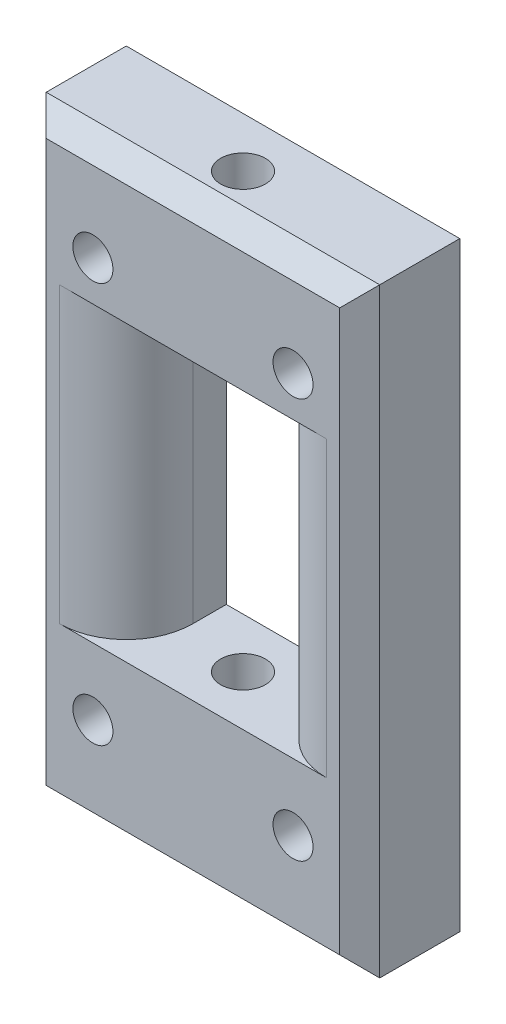
ISO-10303-21;
HEADER;
FILE_DESCRIPTION(('STEP AP214'),'2;1');
FILE_NAME('part.step','',(''),(''),'','','');
FILE_SCHEMA(('AUTOMOTIVE_DESIGN { 1 0 10303 214 1 1 1 1 }'));
ENDSEC;
DATA;
#1=APPLICATION_CONTEXT('core data for automotive mechanical design processes');
#2=APPLICATION_PROTOCOL_DEFINITION('international standard','automotive_design',2000,#1);
#3=PRODUCT_CONTEXT('',#1,'mechanical');
#4=PRODUCT('Part','Part','',(#3));
#5=PRODUCT_RELATED_PRODUCT_CATEGORY('part','',(#4));
#6=PRODUCT_DEFINITION_FORMATION('','',#4);
#7=PRODUCT_DEFINITION_CONTEXT('part definition',#1,'design');
#8=PRODUCT_DEFINITION('design','',#6,#7);
#9=PRODUCT_DEFINITION_SHAPE('','',#8);
#10=(LENGTH_UNIT() NAMED_UNIT(*) SI_UNIT(.MILLI.,.METRE.));
#11=(NAMED_UNIT(*) PLANE_ANGLE_UNIT() SI_UNIT($,.RADIAN.));
#12=(NAMED_UNIT(*) SI_UNIT($,.STERADIAN.) SOLID_ANGLE_UNIT());
#13=UNCERTAINTY_MEASURE_WITH_UNIT(LENGTH_MEASURE(1.E-05),#10,'distance_accuracy_value','');
#14=(GEOMETRIC_REPRESENTATION_CONTEXT(3) GLOBAL_UNCERTAINTY_ASSIGNED_CONTEXT((#13)) GLOBAL_UNIT_ASSIGNED_CONTEXT((#10,
#11,#12)) REPRESENTATION_CONTEXT('',''));
#15=CARTESIAN_POINT('',(0.,0.,0.));
#16=DIRECTION('',(0.,0.,1.));
#17=DIRECTION('',(1.,0.,0.));
#18=AXIS2_PLACEMENT_3D('',#15,#16,#17);
#19=CARTESIAN_POINT('',(100.,5.,7.5));
#20=DIRECTION('',(0.,1.,0.));
#21=DIRECTION('',(0.,0.,1.));
#22=AXIS2_PLACEMENT_3D('',#19,#20,#21);
#23=CYLINDRICAL_SURFACE('',#22,3.35);
#24=CARTESIAN_POINT('',(100.,74.,7.5));
#25=DIRECTION('',(0.,1.,0.));
#26=DIRECTION('',(0.,0.,1.));
#27=AXIS2_PLACEMENT_3D('',#24,#25,#26);
#28=CIRCLE('',#27,3.35);
#29=CARTESIAN_POINT('',(100.,74.,10.85));
#30=VERTEX_POINT('',#29);
#31=EDGE_CURVE('E173',#30,#30,#28,.F.);
#32=CARTESIAN_POINT('',(100.,95.,7.5));
#33=DIRECTION('',(0.,1.,0.));
#34=DIRECTION('',(0.,0.,1.));
#35=AXIS2_PLACEMENT_3D('',#32,#33,#34);
#36=CIRCLE('',#35,3.35);
#37=CARTESIAN_POINT('',(100.,95.,10.85));
#38=VERTEX_POINT('',#37);
#39=EDGE_CURVE('E170',#38,#38,#36,.T.);
#40=CARTESIAN_POINT('',(100.,74.,10.85));
#41=CARTESIAN_POINT('',(100.,74.21875,10.85));
#42=CARTESIAN_POINT('',(100.,74.4375,10.85));
#43=CARTESIAN_POINT('',(100.,74.875,10.85));
#44=CARTESIAN_POINT('',(100.,75.09375,10.85));
#45=CARTESIAN_POINT('',(100.,75.53125,10.85));
#46=CARTESIAN_POINT('',(100.,75.75,10.85));
#47=CARTESIAN_POINT('',(100.,76.1875,10.85));
#48=CARTESIAN_POINT('',(100.,76.40625,10.85));
#49=CARTESIAN_POINT('',(100.,76.84375,10.85));
#50=CARTESIAN_POINT('',(100.,77.0625,10.85));
#51=CARTESIAN_POINT('',(100.,77.5,10.85));
#52=CARTESIAN_POINT('',(100.,77.71875,10.85));
#53=CARTESIAN_POINT('',(100.,78.15625,10.85));
#54=CARTESIAN_POINT('',(100.,78.375,10.85));
#55=CARTESIAN_POINT('',(100.,78.8125,10.85));
#56=CARTESIAN_POINT('',(100.,79.03125,10.85));
#57=CARTESIAN_POINT('',(100.,79.46875,10.85));
#58=CARTESIAN_POINT('',(100.,79.6875,10.85));
#59=CARTESIAN_POINT('',(100.,80.125,10.85));
#60=CARTESIAN_POINT('',(100.,80.34375,10.85));
#61=CARTESIAN_POINT('',(100.,80.78125,10.85));
#62=CARTESIAN_POINT('',(100.,81.,10.85));
#63=CARTESIAN_POINT('',(100.,81.4375,10.85));
#64=CARTESIAN_POINT('',(100.,81.65625,10.85));
#65=CARTESIAN_POINT('',(100.,82.09375,10.85));
#66=CARTESIAN_POINT('',(100.,82.3125,10.85));
#67=CARTESIAN_POINT('',(100.,82.75,10.85));
#68=CARTESIAN_POINT('',(100.,82.96875,10.85));
#69=CARTESIAN_POINT('',(100.,83.40625,10.85));
#70=CARTESIAN_POINT('',(100.,83.625,10.85));
#71=CARTESIAN_POINT('',(100.,84.0625,10.85));
#72=CARTESIAN_POINT('',(100.,84.28125,10.85));
#73=CARTESIAN_POINT('',(100.,84.71875,10.85));
#74=CARTESIAN_POINT('',(100.,84.9375,10.85));
#75=CARTESIAN_POINT('',(100.,85.375,10.85));
#76=CARTESIAN_POINT('',(100.,85.59375,10.85));
#77=CARTESIAN_POINT('',(100.,86.03125,10.85));
#78=CARTESIAN_POINT('',(100.,86.25,10.85));
#79=CARTESIAN_POINT('',(100.,86.6875,10.85));
#80=CARTESIAN_POINT('',(100.,86.90625,10.85));
#81=CARTESIAN_POINT('',(100.,87.34375,10.85));
#82=CARTESIAN_POINT('',(100.,87.5625,10.85));
#83=CARTESIAN_POINT('',(100.,88.,10.85));
#84=CARTESIAN_POINT('',(100.,88.21875,10.85));
#85=CARTESIAN_POINT('',(100.,88.65625,10.85));
#86=CARTESIAN_POINT('',(100.,88.875,10.85));
#87=CARTESIAN_POINT('',(100.,89.3125,10.85));
#88=CARTESIAN_POINT('',(100.,89.53125,10.85));
#89=CARTESIAN_POINT('',(100.,89.96875,10.85));
#90=CARTESIAN_POINT('',(100.,90.1875,10.85));
#91=CARTESIAN_POINT('',(100.,90.625,10.85));
#92=CARTESIAN_POINT('',(100.,90.84375,10.85));
#93=CARTESIAN_POINT('',(100.,91.28125,10.85));
#94=CARTESIAN_POINT('',(100.,91.5,10.85));
#95=CARTESIAN_POINT('',(100.,91.9375,10.85));
#96=CARTESIAN_POINT('',(100.,92.15625,10.85));
#97=CARTESIAN_POINT('',(100.,92.59375,10.85));
#98=CARTESIAN_POINT('',(100.,92.8125,10.85));
#99=CARTESIAN_POINT('',(100.,93.25,10.85));
#100=CARTESIAN_POINT('',(100.,93.46875,10.85));
#101=CARTESIAN_POINT('',(100.,93.90625,10.85));
#102=CARTESIAN_POINT('',(100.,94.125,10.85));
#103=CARTESIAN_POINT('',(100.,94.5625,10.85));
#104=CARTESIAN_POINT('',(100.,94.78125,10.85));
#105=CARTESIAN_POINT('',(100.,95.,10.85));
#106=B_SPLINE_CURVE_WITH_KNOTS('',3,(#40,#41,#42,#43,#44,#45,#46,#47,#48,#49,#50,#51,#52,#53,
#54,#55,#56,#57,#58,#59,#60,#61,#62,#63,#64,#65,#66,#67,#68,#69,#70,#71,#72,#73,#74,#75,#76,#77,
#78,#79,#80,#81,#82,#83,#84,#85,#86,#87,#88,#89,#90,#91,#92,#93,#94,#95,#96,#97,#98,#99,#100,
#101,#102,#103,#104,#105),.UNSPECIFIED.,.F.,.F.,(4,2,2,2,2,2,2,2,2,2,2,2,2,2,2,2,2,2,2,2,2,2,2,
2,2,2,2,2,2,2,2,2,4),(0.,0.656249999999997,1.31249999999999,1.96875000000001,2.625,3.28125,
3.9375,4.59374999999999,5.25,5.90625,6.5625,7.21875,7.87499999999999,8.53124999999999,9.1875,
9.84375,10.5,11.15625,11.8125,12.46875,13.125,13.78125,14.4375,15.09375,15.75,16.40625,17.0625,
17.71875,18.375,19.03125,19.6875,20.34375,21.),.UNSPECIFIED.);
#107=EDGE_CURVE('BSEAM35',#30,#38,#106,.T.);
#108=ORIENTED_EDGE('',*,*,#31,.T.);
#109=ORIENTED_EDGE('',*,*,#39,.T.);
#110=ORIENTED_EDGE('',*,*,#107,.T.);
#111=ORIENTED_EDGE('',*,*,#107,.F.);
#112=EDGE_LOOP('',(#108,#110,#109,#111));
#113=FACE_BOUND('',#112,.T.);
#114=ADVANCED_FACE('F35',(#113),#23,.F.);
#115=CARTESIAN_POINT('',(0.,0.,15.));
#116=DIRECTION('',(0.,0.,1.));
#117=DIRECTION('',(1.,0.,0.));
#118=AXIS2_PLACEMENT_3D('',#115,#116,#117);
#119=PLANE('',#118);
#120=DIRECTION('',(0.,-1.,0.));
#121=VECTOR('',#120,1.);
#122=CARTESIAN_POINT('',(78.,5.,15.));
#123=LINE('',#122,#121);
#124=CARTESIAN_POINT('',(78.,92.,15.));
#125=VERTEX_POINT('',#124);
#126=CARTESIAN_POINT('',(78.,8.,15.));
#127=VERTEX_POINT('',#126);
#128=EDGE_CURVE('E217',#125,#127,#123,.T.);
#129=ORIENTED_EDGE('',*,*,#128,.T.);
#130=DIRECTION('',(1.,0.,0.));
#131=VECTOR('',#130,1.);
#132=CARTESIAN_POINT('',(125.,8.,15.));
#133=LINE('',#132,#131);
#134=CARTESIAN_POINT('',(122.,8.,15.));
#135=VERTEX_POINT('',#134);
#136=EDGE_CURVE('E227',#127,#135,#133,.T.);
#137=ORIENTED_EDGE('',*,*,#136,.T.);
#138=DIRECTION('',(0.,1.,0.));
#139=VECTOR('',#138,1.);
#140=CARTESIAN_POINT('',(122.,95.,15.));
#141=LINE('',#140,#139);
#142=CARTESIAN_POINT('',(122.,92.,15.));
#143=VERTEX_POINT('',#142);
#144=EDGE_CURVE('E225',#135,#143,#141,.T.);
#145=ORIENTED_EDGE('',*,*,#144,.T.);
#146=DIRECTION('',(-1.,0.,0.));
#147=VECTOR('',#146,1.);
#148=CARTESIAN_POINT('',(75.,92.,15.));
#149=LINE('',#148,#147);
#150=EDGE_CURVE('E223',#143,#125,#149,.T.);
#151=ORIENTED_EDGE('',*,*,#150,.T.);
#152=EDGE_LOOP('',(#129,#137,#145,#151));
#153=FACE_BOUND('',#152,.T.);
#154=DIRECTION('',(1.,0.,0.));
#155=VECTOR('',#154,1.);
#156=CARTESIAN_POINT('',(110.,30.,15.));
#157=LINE('',#156,#155);
#158=CARTESIAN_POINT('',(80.,30.,15.));
#159=VERTEX_POINT('',#158);
#160=CARTESIAN_POINT('',(120.,30.,15.));
#161=VERTEX_POINT('',#160);
#162=EDGE_CURVE('E151',#159,#161,#157,.T.);
#163=ORIENTED_EDGE('',*,*,#162,.F.);
#164=DIRECTION('',(0.,-1.,0.));
#165=VECTOR('',#164,1.);
#166=CARTESIAN_POINT('',(80.,74.,15.));
#167=LINE('',#166,#165);
#168=CARTESIAN_POINT('',(80.,74.,15.));
#169=VERTEX_POINT('',#168);
#170=EDGE_CURVE('E253',#159,#169,#167,.F.);
#171=ORIENTED_EDGE('',*,*,#170,.T.);
#172=DIRECTION('',(-1.,0.,0.));
#173=VECTOR('',#172,1.);
#174=CARTESIAN_POINT('',(90.,74.,15.));
#175=LINE('',#174,#173);
#176=CARTESIAN_POINT('',(120.,74.,15.));
#177=VERTEX_POINT('',#176);
#178=EDGE_CURVE('E153',#177,#169,#175,.T.);
#179=ORIENTED_EDGE('',*,*,#178,.F.);
#180=DIRECTION('',(0.,1.,0.));
#181=VECTOR('',#180,1.);
#182=CARTESIAN_POINT('',(120.,30.,15.));
#183=LINE('',#182,#181);
#184=EDGE_CURVE('E250',#177,#161,#183,.F.);
#185=ORIENTED_EDGE('',*,*,#184,.T.);
#186=EDGE_LOOP('',(#163,#171,#179,#185));
#187=FACE_BOUND('',#186,.T.);
#188=CARTESIAN_POINT('',(115.,80.,15.));
#189=DIRECTION('',(0.,0.,1.));
#190=DIRECTION('',(1.,0.,0.));
#191=AXIS2_PLACEMENT_3D('',#188,#189,#190);
#192=CIRCLE('',#191,3.00000000000001);
#193=CARTESIAN_POINT('',(118.,80.,15.));
#194=VERTEX_POINT('',#193);
#195=EDGE_CURVE('E180',#194,#194,#192,.T.);
#196=ORIENTED_EDGE('',*,*,#195,.F.);
#197=EDGE_LOOP('',(#196));
#198=FACE_BOUND('',#197,.T.);
#199=CARTESIAN_POINT('',(115.,20.,15.));
#200=DIRECTION('',(0.,0.,1.));
#201=DIRECTION('',(1.,0.,0.));
#202=AXIS2_PLACEMENT_3D('',#199,#200,#201);
#203=CIRCLE('',#202,3.00000000000001);
#204=CARTESIAN_POINT('',(118.,20.,15.));
#205=VERTEX_POINT('',#204);
#206=EDGE_CURVE('E192',#205,#205,#203,.T.);
#207=ORIENTED_EDGE('',*,*,#206,.F.);
#208=EDGE_LOOP('',(#207));
#209=FACE_BOUND('',#208,.T.);
#210=CARTESIAN_POINT('',(85.,20.,15.));
#211=DIRECTION('',(0.,0.,1.));
#212=DIRECTION('',(1.,0.,0.));
#213=AXIS2_PLACEMENT_3D('',#210,#211,#212);
#214=CIRCLE('',#213,3.00000000000001);
#215=CARTESIAN_POINT('',(88.,20.,15.));
#216=VERTEX_POINT('',#215);
#217=EDGE_CURVE('E186',#216,#216,#214,.T.);
#218=ORIENTED_EDGE('',*,*,#217,.F.);
#219=EDGE_LOOP('',(#218));
#220=FACE_BOUND('',#219,.T.);
#221=CARTESIAN_POINT('',(85.,80.,15.));
#222=DIRECTION('',(0.,0.,1.));
#223=DIRECTION('',(1.,0.,0.));
#224=AXIS2_PLACEMENT_3D('',#221,#222,#223);
#225=CIRCLE('',#224,3.00000000000001);
#226=CARTESIAN_POINT('',(88.,80.,15.));
#227=VERTEX_POINT('',#226);
#228=EDGE_CURVE('E174',#227,#227,#225,.T.);
#229=ORIENTED_EDGE('',*,*,#228,.F.);
#230=EDGE_LOOP('',(#229));
#231=FACE_BOUND('',#230,.T.);
#232=ADVANCED_FACE('F262',(#153,#187,#198,#209,#220,#231),#119,.T.);
#233=CARTESIAN_POINT('',(0.,0.,0.));
#234=DIRECTION('',(0.,0.,1.));
#235=DIRECTION('',(1.,0.,0.));
#236=AXIS2_PLACEMENT_3D('',#233,#234,#235);
#237=PLANE('',#236);
#238=DIRECTION('',(0.,1.,0.));
#239=VECTOR('',#238,1.);
#240=CARTESIAN_POINT('',(110.,70.,0.));
#241=LINE('',#240,#239);
#242=CARTESIAN_POINT('',(110.,30.,0.));
#243=VERTEX_POINT('',#242);
#244=CARTESIAN_POINT('',(110.,74.,0.));
#245=VERTEX_POINT('',#244);
#246=EDGE_CURVE('E137',#243,#245,#241,.T.);
#247=ORIENTED_EDGE('',*,*,#246,.T.);
#248=DIRECTION('',(-1.,0.,0.));
#249=VECTOR('',#248,1.);
#250=CARTESIAN_POINT('',(90.,74.,0.));
#251=LINE('',#250,#249);
#252=CARTESIAN_POINT('',(90.,74.,0.));
#253=VERTEX_POINT('',#252);
#254=EDGE_CURVE('E129',#245,#253,#251,.T.);
#255=ORIENTED_EDGE('',*,*,#254,.T.);
#256=DIRECTION('',(0.,-1.,0.));
#257=VECTOR('',#256,1.);
#258=CARTESIAN_POINT('',(90.,70.,0.));
#259=LINE('',#258,#257);
#260=CARTESIAN_POINT('',(90.,30.,0.));
#261=VERTEX_POINT('',#260);
#262=EDGE_CURVE('E141',#253,#261,#259,.T.);
#263=ORIENTED_EDGE('',*,*,#262,.T.);
#264=DIRECTION('',(1.,0.,0.));
#265=VECTOR('',#264,1.);
#266=CARTESIAN_POINT('',(110.,30.,0.));
#267=LINE('',#266,#265);
#268=EDGE_CURVE('E146',#261,#243,#267,.T.);
#269=ORIENTED_EDGE('',*,*,#268,.T.);
#270=EDGE_LOOP('',(#247,#255,#263,#269));
#271=FACE_BOUND('',#270,.T.);
#272=DIRECTION('',(0.,1.,0.));
#273=VECTOR('',#272,1.);
#274=CARTESIAN_POINT('',(125.,95.,0.));
#275=LINE('',#274,#273);
#276=CARTESIAN_POINT('',(125.,5.,0.));
#277=VERTEX_POINT('',#276);
#278=CARTESIAN_POINT('',(125.,95.,0.));
#279=VERTEX_POINT('',#278);
#280=EDGE_CURVE('E195',#277,#279,#275,.T.);
#281=ORIENTED_EDGE('',*,*,#280,.F.);
#282=DIRECTION('',(1.,0.,0.));
#283=VECTOR('',#282,1.);
#284=CARTESIAN_POINT('',(75.,5.,0.));
#285=LINE('',#284,#283);
#286=CARTESIAN_POINT('',(75.,5.,0.));
#287=VERTEX_POINT('',#286);
#288=EDGE_CURVE('E206',#287,#277,#285,.T.);
#289=ORIENTED_EDGE('',*,*,#288,.F.);
#290=DIRECTION('',(0.,-1.,0.));
#291=VECTOR('',#290,1.);
#292=CARTESIAN_POINT('',(75.,95.,0.));
#293=LINE('',#292,#291);
#294=CARTESIAN_POINT('',(75.,95.,0.));
#295=VERTEX_POINT('',#294);
#296=EDGE_CURVE('E203',#295,#287,#293,.T.);
#297=ORIENTED_EDGE('',*,*,#296,.F.);
#298=DIRECTION('',(-1.,0.,0.));
#299=VECTOR('',#298,1.);
#300=CARTESIAN_POINT('',(75.,95.,0.));
#301=LINE('',#300,#299);
#302=EDGE_CURVE('E200',#279,#295,#301,.T.);
#303=ORIENTED_EDGE('',*,*,#302,.F.);
#304=EDGE_LOOP('',(#281,#289,#297,#303));
#305=FACE_BOUND('',#304,.T.);
#306=CARTESIAN_POINT('',(115.,20.,0.));
#307=DIRECTION('',(0.,0.,1.));
#308=DIRECTION('',(1.,0.,0.));
#309=AXIS2_PLACEMENT_3D('',#306,#307,#308);
#310=CIRCLE('',#309,3.00000000000001);
#311=CARTESIAN_POINT('',(118.,20.,0.));
#312=VERTEX_POINT('',#311);
#313=EDGE_CURVE('E189',#312,#312,#310,.T.);
#314=ORIENTED_EDGE('',*,*,#313,.T.);
#315=EDGE_LOOP('',(#314));
#316=FACE_BOUND('',#315,.T.);
#317=CARTESIAN_POINT('',(85.,20.,0.));
#318=DIRECTION('',(0.,0.,1.));
#319=DIRECTION('',(1.,0.,0.));
#320=AXIS2_PLACEMENT_3D('',#317,#318,#319);
#321=CIRCLE('',#320,3.00000000000001);
#322=CARTESIAN_POINT('',(88.,20.,0.));
#323=VERTEX_POINT('',#322);
#324=EDGE_CURVE('E183',#323,#323,#321,.T.);
#325=ORIENTED_EDGE('',*,*,#324,.T.);
#326=EDGE_LOOP('',(#325));
#327=FACE_BOUND('',#326,.T.);
#328=CARTESIAN_POINT('',(115.,80.,0.));
#329=DIRECTION('',(0.,0.,1.));
#330=DIRECTION('',(1.,0.,0.));
#331=AXIS2_PLACEMENT_3D('',#328,#329,#330);
#332=CIRCLE('',#331,3.00000000000001);
#333=CARTESIAN_POINT('',(118.,80.,0.));
#334=VERTEX_POINT('',#333);
#335=EDGE_CURVE('E177',#334,#334,#332,.T.);
#336=ORIENTED_EDGE('',*,*,#335,.T.);
#337=EDGE_LOOP('',(#336));
#338=FACE_BOUND('',#337,.T.);
#339=CARTESIAN_POINT('',(85.,80.,0.));
#340=DIRECTION('',(0.,0.,1.));
#341=DIRECTION('',(1.,0.,0.));
#342=AXIS2_PLACEMENT_3D('',#339,#340,#341);
#343=CIRCLE('',#342,3.00000000000001);
#344=CARTESIAN_POINT('',(88.,80.,0.));
#345=VERTEX_POINT('',#344);
#346=EDGE_CURVE('E169',#345,#345,#343,.T.);
#347=ORIENTED_EDGE('',*,*,#346,.T.);
#348=EDGE_LOOP('',(#347));
#349=FACE_BOUND('',#348,.T.);
#350=ADVANCED_FACE('F148',(#271,#305,#316,#327,#338,#349),#237,.F.);
#351=CARTESIAN_POINT('',(125.,95.,15.));
#352=DIRECTION('',(-1.,0.,0.));
#353=DIRECTION('',(0.,0.,1.));
#354=AXIS2_PLACEMENT_3D('',#351,#352,#353);
#355=PLANE('',#354);
#356=DIRECTION('',(0.,0.,-1.));
#357=VECTOR('',#356,1.);
#358=CARTESIAN_POINT('',(125.,95.,15.));
#359=LINE('',#358,#357);
#360=CARTESIAN_POINT('',(125.,95.,12.));
#361=VERTEX_POINT('',#360);
#362=EDGE_CURVE('E215',#361,#279,#359,.T.);
#363=ORIENTED_EDGE('',*,*,#362,.F.);
#364=DIRECTION('',(0.,-1.,0.));
#365=VECTOR('',#364,1.);
#366=CARTESIAN_POINT('',(125.,5.,12.));
#367=LINE('',#366,#365);
#368=CARTESIAN_POINT('',(125.,5.,12.));
#369=VERTEX_POINT('',#368);
#370=EDGE_CURVE('E233',#361,#369,#367,.T.);
#371=ORIENTED_EDGE('',*,*,#370,.T.);
#372=DIRECTION('',(0.,0.,-1.));
#373=VECTOR('',#372,1.);
#374=CARTESIAN_POINT('',(125.,5.,15.));
#375=LINE('',#374,#373);
#376=EDGE_CURVE('E209',#369,#277,#375,.T.);
#377=ORIENTED_EDGE('',*,*,#376,.T.);
#378=ORIENTED_EDGE('',*,*,#280,.T.);
#379=EDGE_LOOP('',(#363,#371,#377,#378));
#380=FACE_BOUND('',#379,.T.);
#381=ADVANCED_FACE('F370',(#380),#355,.F.);
#382=CARTESIAN_POINT('',(75.,95.,15.));
#383=DIRECTION('',(0.,-1.,0.));
#384=DIRECTION('',(0.,0.,-1.));
#385=AXIS2_PLACEMENT_3D('',#382,#383,#384);
#386=PLANE('',#385);
#387=ORIENTED_EDGE('',*,*,#39,.F.);
#388=EDGE_LOOP('',(#387));
#389=FACE_BOUND('',#388,.T.);
#390=DIRECTION('',(0.,0.,-1.));
#391=VECTOR('',#390,1.);
#392=CARTESIAN_POINT('',(75.,95.,15.));
#393=LINE('',#392,#391);
#394=CARTESIAN_POINT('',(75.,95.,12.));
#395=VERTEX_POINT('',#394);
#396=EDGE_CURVE('E213',#395,#295,#393,.T.);
#397=ORIENTED_EDGE('',*,*,#396,.F.);
#398=DIRECTION('',(1.,0.,0.));
#399=VECTOR('',#398,1.);
#400=CARTESIAN_POINT('',(125.,95.,12.));
#401=LINE('',#400,#399);
#402=EDGE_CURVE('E235',#395,#361,#401,.T.);
#403=ORIENTED_EDGE('',*,*,#402,.T.);
#404=ORIENTED_EDGE('',*,*,#362,.T.);
#405=ORIENTED_EDGE('',*,*,#302,.T.);
#406=EDGE_LOOP('',(#397,#403,#404,#405));
#407=FACE_BOUND('',#406,.T.);
#408=ADVANCED_FACE('F339',(#389,#407),#386,.F.);
#409=CARTESIAN_POINT('',(75.,95.,15.));
#410=DIRECTION('',(1.,0.,0.));
#411=DIRECTION('',(0.,0.,-1.));
#412=AXIS2_PLACEMENT_3D('',#409,#410,#411);
#413=PLANE('',#412);
#414=DIRECTION('',(0.,0.,-1.));
#415=VECTOR('',#414,1.);
#416=CARTESIAN_POINT('',(75.,5.,15.));
#417=LINE('',#416,#415);
#418=CARTESIAN_POINT('',(75.,5.,12.));
#419=VERTEX_POINT('',#418);
#420=EDGE_CURVE('E211',#419,#287,#417,.T.);
#421=ORIENTED_EDGE('',*,*,#420,.F.);
#422=DIRECTION('',(0.,1.,0.));
#423=VECTOR('',#422,1.);
#424=CARTESIAN_POINT('',(75.,95.,12.));
#425=LINE('',#424,#423);
#426=EDGE_CURVE('E237',#419,#395,#425,.T.);
#427=ORIENTED_EDGE('',*,*,#426,.T.);
#428=ORIENTED_EDGE('',*,*,#396,.T.);
#429=ORIENTED_EDGE('',*,*,#296,.T.);
#430=EDGE_LOOP('',(#421,#427,#428,#429));
#431=FACE_BOUND('',#430,.T.);
#432=ADVANCED_FACE('F311',(#431),#413,.F.);
#433=CARTESIAN_POINT('',(75.,5.,15.));
#434=DIRECTION('',(0.,1.,0.));
#435=DIRECTION('',(0.,0.,1.));
#436=AXIS2_PLACEMENT_3D('',#433,#434,#435);
#437=PLANE('',#436);
#438=CARTESIAN_POINT('',(100.,5.,7.5));
#439=DIRECTION('',(0.,1.,0.));
#440=DIRECTION('',(0.,0.,1.));
#441=AXIS2_PLACEMENT_3D('',#438,#439,#440);
#442=CIRCLE('',#441,3.35);
#443=CARTESIAN_POINT('',(100.,5.,10.85));
#444=VERTEX_POINT('',#443);
#445=EDGE_CURVE('E166',#444,#444,#442,.T.);
#446=ORIENTED_EDGE('',*,*,#445,.T.);
#447=EDGE_LOOP('',(#446));
#448=FACE_BOUND('',#447,.T.);
#449=ORIENTED_EDGE('',*,*,#376,.F.);
#450=DIRECTION('',(-1.,0.,0.));
#451=VECTOR('',#450,1.);
#452=CARTESIAN_POINT('',(75.,5.,12.));
#453=LINE('',#452,#451);
#454=EDGE_CURVE('E230',#369,#419,#453,.T.);
#455=ORIENTED_EDGE('',*,*,#454,.T.);
#456=ORIENTED_EDGE('',*,*,#420,.T.);
#457=ORIENTED_EDGE('',*,*,#288,.T.);
#458=EDGE_LOOP('',(#449,#455,#456,#457));
#459=FACE_BOUND('',#458,.T.);
#460=ADVANCED_FACE('F307',(#448,#459),#437,.F.);
#461=CARTESIAN_POINT('',(115.,20.,15.));
#462=DIRECTION('',(0.,0.,-1.));
#463=DIRECTION('',(-1.,0.,0.));
#464=AXIS2_PLACEMENT_3D('',#461,#462,#463);
#465=CYLINDRICAL_SURFACE('',#464,3.00000000000001);
#466=ORIENTED_EDGE('',*,*,#206,.T.);
#467=EDGE_LOOP('',(#466));
#468=FACE_BOUND('',#467,.T.);
#469=ORIENTED_EDGE('',*,*,#313,.F.);
#470=EDGE_LOOP('',(#469));
#471=FACE_BOUND('',#470,.T.);
#472=ADVANCED_FACE('F310',(#468,#471),#465,.F.);
#473=CARTESIAN_POINT('',(85.,20.,15.));
#474=DIRECTION('',(0.,0.,-1.));
#475=DIRECTION('',(-1.,0.,0.));
#476=AXIS2_PLACEMENT_3D('',#473,#474,#475);
#477=CYLINDRICAL_SURFACE('',#476,3.00000000000001);
#478=ORIENTED_EDGE('',*,*,#217,.T.);
#479=EDGE_LOOP('',(#478));
#480=FACE_BOUND('',#479,.T.);
#481=ORIENTED_EDGE('',*,*,#324,.F.);
#482=EDGE_LOOP('',(#481));
#483=FACE_BOUND('',#482,.T.);
#484=ADVANCED_FACE('F386',(#480,#483),#477,.F.);
#485=CARTESIAN_POINT('',(115.,80.,15.));
#486=DIRECTION('',(0.,0.,-1.));
#487=DIRECTION('',(-1.,0.,0.));
#488=AXIS2_PLACEMENT_3D('',#485,#486,#487);
#489=CYLINDRICAL_SURFACE('',#488,3.00000000000001);
#490=ORIENTED_EDGE('',*,*,#195,.T.);
#491=EDGE_LOOP('',(#490));
#492=FACE_BOUND('',#491,.T.);
#493=ORIENTED_EDGE('',*,*,#335,.F.);
#494=EDGE_LOOP('',(#493));
#495=FACE_BOUND('',#494,.T.);
#496=ADVANCED_FACE('F301',(#492,#495),#489,.F.);
#497=CARTESIAN_POINT('',(85.,80.,15.));
#498=DIRECTION('',(0.,0.,-1.));
#499=DIRECTION('',(-1.,0.,0.));
#500=AXIS2_PLACEMENT_3D('',#497,#498,#499);
#501=CYLINDRICAL_SURFACE('',#500,3.00000000000001);
#502=ORIENTED_EDGE('',*,*,#228,.T.);
#503=EDGE_LOOP('',(#502));
#504=FACE_BOUND('',#503,.T.);
#505=ORIENTED_EDGE('',*,*,#346,.F.);
#506=EDGE_LOOP('',(#505));
#507=FACE_BOUND('',#506,.T.);
#508=ADVANCED_FACE('F294',(#504,#507),#501,.F.);
#509=CARTESIAN_POINT('',(100.,30.,7.5));
#510=DIRECTION('',(0.,-1.,0.));
#511=DIRECTION('',(0.,0.,-1.));
#512=AXIS2_PLACEMENT_3D('',#509,#510,#511);
#513=CIRCLE('',#512,3.35);
#514=CARTESIAN_POINT('',(100.,30.,10.85));
#515=VERTEX_POINT('',#514);
#516=EDGE_CURVE('E162',#515,#515,#513,.F.);
#517=CARTESIAN_POINT('',(100.,30.,10.85));
#518=CARTESIAN_POINT('',(100.,29.7395833333333,10.85));
#519=CARTESIAN_POINT('',(100.,29.4791666666667,10.85));
#520=CARTESIAN_POINT('',(100.,28.9583333333333,10.85));
#521=CARTESIAN_POINT('',(100.,28.6979166666667,10.85));
#522=CARTESIAN_POINT('',(100.,28.1770833333333,10.85));
#523=CARTESIAN_POINT('',(100.,27.9166666666667,10.85));
#524=CARTESIAN_POINT('',(100.,27.3958333333333,10.85));
#525=CARTESIAN_POINT('',(100.,27.1354166666667,10.85));
#526=CARTESIAN_POINT('',(100.,26.6145833333333,10.85));
#527=CARTESIAN_POINT('',(100.,26.3541666666667,10.85));
#528=CARTESIAN_POINT('',(100.,25.8333333333333,10.85));
#529=CARTESIAN_POINT('',(100.,25.5729166666667,10.85));
#530=CARTESIAN_POINT('',(100.,25.0520833333333,10.85));
#531=CARTESIAN_POINT('',(100.,24.7916666666667,10.85));
#532=CARTESIAN_POINT('',(100.,24.2708333333333,10.85));
#533=CARTESIAN_POINT('',(100.,24.0104166666667,10.85));
#534=CARTESIAN_POINT('',(100.,23.4895833333333,10.85));
#535=CARTESIAN_POINT('',(100.,23.2291666666667,10.85));
#536=CARTESIAN_POINT('',(100.,22.7083333333333,10.85));
#537=CARTESIAN_POINT('',(100.,22.4479166666667,10.85));
#538=CARTESIAN_POINT('',(100.,21.9270833333333,10.85));
#539=CARTESIAN_POINT('',(100.,21.6666666666667,10.85));
#540=CARTESIAN_POINT('',(100.,21.1458333333333,10.85));
#541=CARTESIAN_POINT('',(100.,20.8854166666667,10.85));
#542=CARTESIAN_POINT('',(100.,20.3645833333333,10.85));
#543=CARTESIAN_POINT('',(100.,20.1041666666667,10.85));
#544=CARTESIAN_POINT('',(100.,19.5833333333333,10.85));
#545=CARTESIAN_POINT('',(100.,19.3229166666667,10.85));
#546=CARTESIAN_POINT('',(100.,18.8020833333333,10.85));
#547=CARTESIAN_POINT('',(100.,18.5416666666667,10.85));
#548=CARTESIAN_POINT('',(100.,18.0208333333333,10.85));
#549=CARTESIAN_POINT('',(100.,17.7604166666667,10.85));
#550=CARTESIAN_POINT('',(100.,17.2395833333333,10.85));
#551=CARTESIAN_POINT('',(100.,16.9791666666667,10.85));
#552=CARTESIAN_POINT('',(100.,16.4583333333333,10.85));
#553=CARTESIAN_POINT('',(100.,16.1979166666667,10.85));
#554=CARTESIAN_POINT('',(100.,15.6770833333333,10.85));
#555=CARTESIAN_POINT('',(100.,15.4166666666667,10.85));
#556=CARTESIAN_POINT('',(100.,14.8958333333333,10.85));
#557=CARTESIAN_POINT('',(100.,14.6354166666667,10.85));
#558=CARTESIAN_POINT('',(100.,14.1145833333333,10.85));
#559=CARTESIAN_POINT('',(100.,13.8541666666667,10.85));
#560=CARTESIAN_POINT('',(100.,13.3333333333333,10.85));
#561=CARTESIAN_POINT('',(100.,13.0729166666667,10.85));
#562=CARTESIAN_POINT('',(100.,12.5520833333333,10.85));
#563=CARTESIAN_POINT('',(100.,12.2916666666667,10.85));
#564=CARTESIAN_POINT('',(100.,11.7708333333333,10.85));
#565=CARTESIAN_POINT('',(100.,11.5104166666667,10.85));
#566=CARTESIAN_POINT('',(100.,10.9895833333333,10.85));
#567=CARTESIAN_POINT('',(100.,10.7291666666667,10.85));
#568=CARTESIAN_POINT('',(100.,10.2083333333333,10.85));
#569=CARTESIAN_POINT('',(100.,9.94791666666667,10.85));
#570=CARTESIAN_POINT('',(100.,9.42708333333334,10.85));
#571=CARTESIAN_POINT('',(100.,9.16666666666667,10.85));
#572=CARTESIAN_POINT('',(100.,8.64583333333334,10.85));
#573=CARTESIAN_POINT('',(100.,8.38541666666667,10.85));
#574=CARTESIAN_POINT('',(100.,7.86458333333334,10.85));
#575=CARTESIAN_POINT('',(100.,7.60416666666667,10.85));
#576=CARTESIAN_POINT('',(100.,7.08333333333334,10.85));
#577=CARTESIAN_POINT('',(100.,6.82291666666667,10.85));
#578=CARTESIAN_POINT('',(100.,6.30208333333334,10.85));
#579=CARTESIAN_POINT('',(100.,6.04166666666667,10.85));
#580=CARTESIAN_POINT('',(100.,5.52083333333334,10.85));
#581=CARTESIAN_POINT('',(100.,5.26041666666667,10.85));
#582=CARTESIAN_POINT('',(100.,5.,10.85));
#583=B_SPLINE_CURVE_WITH_KNOTS('',3,(#517,#518,#519,#520,#521,#522,#523,#524,#525,#526,#527,
#528,#529,#530,#531,#532,#533,#534,#535,#536,#537,#538,#539,#540,#541,#542,#543,#544,#545,#546,
#547,#548,#549,#550,#551,#552,#553,#554,#555,#556,#557,#558,#559,#560,#561,#562,#563,#564,#565,
#566,#567,#568,#569,#570,#571,#572,#573,#574,#575,#576,#577,#578,#579,#580,#581,#582),
.UNSPECIFIED.,.F.,.F.,(4,2,2,2,2,2,2,2,2,2,2,2,2,2,2,2,2,2,2,2,2,2,2,2,2,2,2,2,2,2,2,2,4),(0.,
0.781250000000001,1.5625,2.34375,3.125,3.90625,4.6875,5.46875,6.25,7.03125,7.8125,8.59375,9.375,
10.15625,10.9375,11.71875,12.5,13.28125,14.0625,14.84375,15.625,16.40625,17.1875,17.96875,18.75,
19.53125,20.3125,21.09375,21.875,22.65625,23.4375,24.21875,25.),.UNSPECIFIED.);
#584=EDGE_CURVE('BSEAM283',#515,#444,#583,.T.);
#585=ORIENTED_EDGE('',*,*,#516,.T.);
#586=ORIENTED_EDGE('',*,*,#445,.F.);
#587=ORIENTED_EDGE('',*,*,#584,.T.);
#588=ORIENTED_EDGE('',*,*,#584,.F.);
#589=EDGE_LOOP('',(#585,#587,#586,#588));
#590=FACE_BOUND('',#589,.T.);
#591=ADVANCED_FACE('F283',(#590),#23,.F.);
#592=CARTESIAN_POINT('',(90.,74.,0.));
#593=DIRECTION('',(0.,1.,0.));
#594=DIRECTION('',(0.,0.,1.));
#595=AXIS2_PLACEMENT_3D('',#592,#593,#594);
#596=PLANE('',#595);
#597=ORIENTED_EDGE('',*,*,#178,.T.);
#598=CARTESIAN_POINT('',(80.,74.,5.));
#599=DIRECTION('',(0.,1.,0.));
#600=DIRECTION('',(0.,0.,1.));
#601=AXIS2_PLACEMENT_3D('',#598,#599,#600);
#602=CIRCLE('',#601,10.);
#603=CARTESIAN_POINT('',(90.,74.,5.));
#604=VERTEX_POINT('',#603);
#605=EDGE_CURVE('E132',#169,#604,#602,.T.);
#606=ORIENTED_EDGE('',*,*,#605,.T.);
#607=DIRECTION('',(0.,0.,1.));
#608=VECTOR('',#607,1.);
#609=CARTESIAN_POINT('',(90.,74.,0.));
#610=LINE('',#609,#608);
#611=EDGE_CURVE('E123',#253,#604,#610,.T.);
#612=ORIENTED_EDGE('',*,*,#611,.F.);
#613=ORIENTED_EDGE('',*,*,#254,.F.);
#614=DIRECTION('',(0.,0.,1.));
#615=VECTOR('',#614,1.);
#616=CARTESIAN_POINT('',(110.,74.,0.));
#617=LINE('',#616,#615);
#618=CARTESIAN_POINT('',(110.,74.,5.));
#619=VERTEX_POINT('',#618);
#620=EDGE_CURVE('E160',#245,#619,#617,.T.);
#621=ORIENTED_EDGE('',*,*,#620,.T.);
#622=CARTESIAN_POINT('',(120.,74.,5.));
#623=DIRECTION('',(0.,1.,0.));
#624=DIRECTION('',(0.,0.,1.));
#625=AXIS2_PLACEMENT_3D('',#622,#623,#624);
#626=CIRCLE('',#625,10.);
#627=EDGE_CURVE('E43',#619,#177,#626,.T.);
#628=ORIENTED_EDGE('',*,*,#627,.T.);
#629=EDGE_LOOP('',(#597,#606,#612,#613,#621,#628));
#630=FACE_BOUND('',#629,.T.);
#631=ORIENTED_EDGE('',*,*,#31,.F.);
#632=EDGE_LOOP('',(#631));
#633=FACE_BOUND('',#632,.T.);
#634=ADVANCED_FACE('F125',(#630,#633),#596,.F.);
#635=CARTESIAN_POINT('',(110.,30.,0.));
#636=DIRECTION('',(0.,-1.,0.));
#637=DIRECTION('',(0.,0.,-1.));
#638=AXIS2_PLACEMENT_3D('',#635,#636,#637);
#639=PLANE('',#638);
#640=ORIENTED_EDGE('',*,*,#162,.T.);
#641=CARTESIAN_POINT('',(120.,30.,5.));
#642=DIRECTION('',(0.,-1.,0.));
#643=DIRECTION('',(0.,0.,-1.));
#644=AXIS2_PLACEMENT_3D('',#641,#642,#643);
#645=CIRCLE('',#644,10.);
#646=CARTESIAN_POINT('',(110.,30.,5.));
#647=VERTEX_POINT('',#646);
#648=EDGE_CURVE('E11',#161,#647,#645,.T.);
#649=ORIENTED_EDGE('',*,*,#648,.T.);
#650=DIRECTION('',(0.,0.,1.));
#651=VECTOR('',#650,1.);
#652=CARTESIAN_POINT('',(110.,30.,0.));
#653=LINE('',#652,#651);
#654=EDGE_CURVE('E163',#243,#647,#653,.T.);
#655=ORIENTED_EDGE('',*,*,#654,.F.);
#656=ORIENTED_EDGE('',*,*,#268,.F.);
#657=DIRECTION('',(0.,0.,1.));
#658=VECTOR('',#657,1.);
#659=CARTESIAN_POINT('',(90.,30.,0.));
#660=LINE('',#659,#658);
#661=CARTESIAN_POINT('',(90.,30.,5.));
#662=VERTEX_POINT('',#661);
#663=EDGE_CURVE('E136',#261,#662,#660,.T.);
#664=ORIENTED_EDGE('',*,*,#663,.T.);
#665=CARTESIAN_POINT('',(80.,30.,5.));
#666=DIRECTION('',(0.,-1.,0.));
#667=DIRECTION('',(0.,0.,-1.));
#668=AXIS2_PLACEMENT_3D('',#665,#666,#667);
#669=CIRCLE('',#668,10.);
#670=EDGE_CURVE('E258',#662,#159,#669,.T.);
#671=ORIENTED_EDGE('',*,*,#670,.T.);
#672=EDGE_LOOP('',(#640,#649,#655,#656,#664,#671));
#673=FACE_BOUND('',#672,.T.);
#674=ORIENTED_EDGE('',*,*,#516,.F.);
#675=EDGE_LOOP('',(#674));
#676=FACE_BOUND('',#675,.T.);
#677=ADVANCED_FACE('F267',(#673,#676),#639,.F.);
#678=CARTESIAN_POINT('',(110.,74.,0.));
#679=DIRECTION('',(1.,0.,0.));
#680=DIRECTION('',(0.,0.,-1.));
#681=AXIS2_PLACEMENT_3D('',#678,#679,#680);
#682=PLANE('',#681);
#683=ORIENTED_EDGE('',*,*,#654,.T.);
#684=DIRECTION('',(0.,1.,0.));
#685=VECTOR('',#684,1.);
#686=CARTESIAN_POINT('',(110.,74.,5.));
#687=LINE('',#686,#685);
#688=EDGE_CURVE('E256',#647,#619,#687,.T.);
#689=ORIENTED_EDGE('',*,*,#688,.T.);
#690=ORIENTED_EDGE('',*,*,#620,.F.);
#691=ORIENTED_EDGE('',*,*,#246,.F.);
#692=EDGE_LOOP('',(#683,#689,#690,#691));
#693=FACE_BOUND('',#692,.T.);
#694=ADVANCED_FACE('F270',(#693),#682,.F.);
#695=CARTESIAN_POINT('',(90.,30.,0.));
#696=DIRECTION('',(-1.,0.,0.));
#697=DIRECTION('',(0.,0.,1.));
#698=AXIS2_PLACEMENT_3D('',#695,#696,#697);
#699=PLANE('',#698);
#700=ORIENTED_EDGE('',*,*,#611,.T.);
#701=DIRECTION('',(0.,-1.,0.));
#702=VECTOR('',#701,1.);
#703=CARTESIAN_POINT('',(90.,30.,5.));
#704=LINE('',#703,#702);
#705=EDGE_CURVE('E239',#604,#662,#704,.T.);
#706=ORIENTED_EDGE('',*,*,#705,.T.);
#707=ORIENTED_EDGE('',*,*,#663,.F.);
#708=ORIENTED_EDGE('',*,*,#262,.F.);
#709=EDGE_LOOP('',(#700,#706,#707,#708));
#710=FACE_BOUND('',#709,.T.);
#711=ADVANCED_FACE('F142',(#710),#699,.F.);
#712=CARTESIAN_POINT('',(0.,92.,15.));
#713=DIRECTION('',(0.,0.707106781186549,0.707106781186546));
#714=DIRECTION('',(1.,0.,0.));
#715=AXIS2_PLACEMENT_3D('',#712,#713,#714);
#716=PLANE('',#715);
#717=DIRECTION('',(0.577350269189625,0.577350269189625,-0.577350269189628));
#718=VECTOR('',#717,1.);
#719=CARTESIAN_POINT('',(81.3333333333335,51.3333333333334,55.6666666666667));
#720=LINE('',#719,#718);
#721=EDGE_CURVE('E244',#361,#143,#720,.F.);
#722=ORIENTED_EDGE('',*,*,#721,.F.);
#723=ORIENTED_EDGE('',*,*,#402,.F.);
#724=DIRECTION('',(-0.577350269189625,0.577350269189625,-0.577350269189628));
#725=VECTOR('',#724,1.);
#726=CARTESIAN_POINT('',(108.666666666667,61.3333333333334,45.6666666666667));
#727=LINE('',#726,#725);
#728=EDGE_CURVE('E158',#125,#395,#727,.T.);
#729=ORIENTED_EDGE('',*,*,#728,.F.);
#730=ORIENTED_EDGE('',*,*,#150,.F.);
#731=EDGE_LOOP('',(#722,#723,#729,#730));
#732=FACE_BOUND('',#731,.T.);
#733=ADVANCED_FACE('F277',(#732),#716,.T.);
#734=CARTESIAN_POINT('',(78.,0.,15.));
#735=DIRECTION('',(-0.707106781186549,0.,0.707106781186546));
#736=DIRECTION('',(0.,1.,0.));
#737=AXIS2_PLACEMENT_3D('',#734,#735,#736);
#738=PLANE('',#737);
#739=ORIENTED_EDGE('',*,*,#728,.T.);
#740=ORIENTED_EDGE('',*,*,#426,.F.);
#741=DIRECTION('',(0.577350269189625,0.577350269189625,0.577350269189628));
#742=VECTOR('',#741,1.);
#743=CARTESIAN_POINT('',(75.3333333333334,5.33333333333334,12.3333333333333));
#744=LINE('',#743,#742);
#745=EDGE_CURVE('E242',#127,#419,#744,.F.);
#746=ORIENTED_EDGE('',*,*,#745,.F.);
#747=ORIENTED_EDGE('',*,*,#128,.F.);
#748=EDGE_LOOP('',(#739,#740,#746,#747));
#749=FACE_BOUND('',#748,.T.);
#750=ADVANCED_FACE('F334',(#749),#738,.T.);
#751=CARTESIAN_POINT('',(122.,0.,15.));
#752=DIRECTION('',(0.707106781186549,0.,0.707106781186546));
#753=DIRECTION('',(0.,-1.,0.));
#754=AXIS2_PLACEMENT_3D('',#751,#752,#753);
#755=PLANE('',#754);
#756=ORIENTED_EDGE('',*,*,#721,.T.);
#757=ORIENTED_EDGE('',*,*,#144,.F.);
#758=DIRECTION('',(0.577350269189625,-0.577350269189625,-0.577350269189628));
#759=VECTOR('',#758,1.);
#760=CARTESIAN_POINT('',(124.666666666667,5.33333333333334,12.3333333333333));
#761=LINE('',#760,#759);
#762=EDGE_CURVE('E240',#369,#135,#761,.F.);
#763=ORIENTED_EDGE('',*,*,#762,.F.);
#764=ORIENTED_EDGE('',*,*,#370,.F.);
#765=EDGE_LOOP('',(#756,#757,#763,#764));
#766=FACE_BOUND('',#765,.T.);
#767=ADVANCED_FACE('F328',(#766),#755,.T.);
#768=CARTESIAN_POINT('',(0.,8.,15.));
#769=DIRECTION('',(0.,-0.707106781186549,0.707106781186546));
#770=DIRECTION('',(-1.,0.,0.));
#771=AXIS2_PLACEMENT_3D('',#768,#769,#770);
#772=PLANE('',#771);
#773=ORIENTED_EDGE('',*,*,#745,.T.);
#774=ORIENTED_EDGE('',*,*,#454,.F.);
#775=ORIENTED_EDGE('',*,*,#762,.T.);
#776=ORIENTED_EDGE('',*,*,#136,.F.);
#777=EDGE_LOOP('',(#773,#774,#775,#776));
#778=FACE_BOUND('',#777,.T.);
#779=ADVANCED_FACE('F321',(#778),#772,.T.);
#780=CARTESIAN_POINT('',(80.,30.,5.));
#781=DIRECTION('',(0.,1.,0.));
#782=DIRECTION('',(0.,0.,1.));
#783=AXIS2_PLACEMENT_3D('',#780,#781,#782);
#784=CYLINDRICAL_SURFACE('',#783,10.);
#785=ORIENTED_EDGE('',*,*,#605,.F.);
#786=ORIENTED_EDGE('',*,*,#170,.F.);
#787=ORIENTED_EDGE('',*,*,#670,.F.);
#788=ORIENTED_EDGE('',*,*,#705,.F.);
#789=EDGE_LOOP('',(#785,#786,#787,#788));
#790=FACE_BOUND('',#789,.T.);
#791=ADVANCED_FACE('F266',(#790),#784,.T.);
#792=CARTESIAN_POINT('',(120.,74.,5.));
#793=DIRECTION('',(0.,-1.,0.));
#794=DIRECTION('',(0.,0.,-1.));
#795=AXIS2_PLACEMENT_3D('',#792,#793,#794);
#796=CYLINDRICAL_SURFACE('',#795,10.);
#797=ORIENTED_EDGE('',*,*,#648,.F.);
#798=ORIENTED_EDGE('',*,*,#184,.F.);
#799=ORIENTED_EDGE('',*,*,#627,.F.);
#800=ORIENTED_EDGE('',*,*,#688,.F.);
#801=EDGE_LOOP('',(#797,#798,#799,#800));
#802=FACE_BOUND('',#801,.T.);
#803=ADVANCED_FACE('F37',(#802),#796,.T.);
#804=CLOSED_SHELL('',(#114,#232,#350,#381,#408,#432,#460,#472,#484,#496,#508,#591,#634,#677,
#694,#711,#733,#750,#767,#779,#791,#803));
#805=MANIFOLD_SOLID_BREP('B2',#804);
#806=ADVANCED_BREP_SHAPE_REPRESENTATION('',(#18,#805),#14);
#807=SHAPE_DEFINITION_REPRESENTATION(#9,#806);
ENDSEC;
END-ISO-10303-21;
